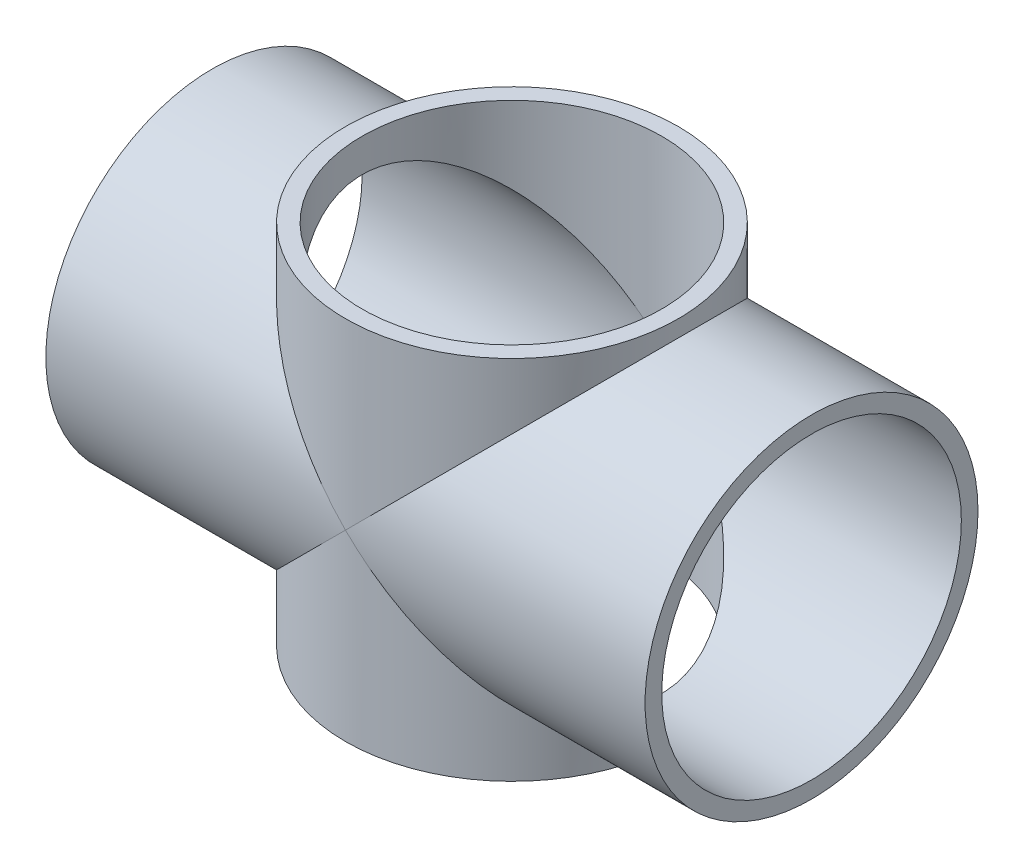
ISO-10303-21;
HEADER;
FILE_DESCRIPTION(('STEP AP214'),'2;1');
FILE_NAME('part.step','',(''),(''),'','','');
FILE_SCHEMA(('AUTOMOTIVE_DESIGN { 1 0 10303 214 1 1 1 1 }'));
ENDSEC;
DATA;
#1=APPLICATION_CONTEXT('core data for automotive mechanical design processes');
#2=APPLICATION_PROTOCOL_DEFINITION('international standard','automotive_design',2000,#1);
#3=PRODUCT_CONTEXT('',#1,'mechanical');
#4=PRODUCT('Part','Part','',(#3));
#5=PRODUCT_RELATED_PRODUCT_CATEGORY('part','',(#4));
#6=PRODUCT_DEFINITION_FORMATION('','',#4);
#7=PRODUCT_DEFINITION_CONTEXT('part definition',#1,'design');
#8=PRODUCT_DEFINITION('design','',#6,#7);
#9=PRODUCT_DEFINITION_SHAPE('','',#8);
#10=(LENGTH_UNIT() NAMED_UNIT(*) SI_UNIT(.MILLI.,.METRE.));
#11=(NAMED_UNIT(*) PLANE_ANGLE_UNIT() SI_UNIT($,.RADIAN.));
#12=(NAMED_UNIT(*) SI_UNIT($,.STERADIAN.) SOLID_ANGLE_UNIT());
#13=UNCERTAINTY_MEASURE_WITH_UNIT(LENGTH_MEASURE(1.E-05),#10,'distance_accuracy_value','');
#14=(GEOMETRIC_REPRESENTATION_CONTEXT(3) GLOBAL_UNCERTAINTY_ASSIGNED_CONTEXT((#13)) GLOBAL_UNIT_ASSIGNED_CONTEXT((#10,
#11,#12)) REPRESENTATION_CONTEXT('',''));
#15=CARTESIAN_POINT('',(0.,0.,0.));
#16=DIRECTION('',(0.,0.,1.));
#17=DIRECTION('',(1.,0.,0.));
#18=AXIS2_PLACEMENT_3D('',#15,#16,#17);
#19=CARTESIAN_POINT('',(-114.3,114.3,0.));
#20=DIRECTION('',(1.,0.,0.));
#21=DIRECTION('',(0.,0.,-1.));
#22=AXIS2_PLACEMENT_3D('',#19,#20,#21);
#23=CYLINDRICAL_SURFACE('',#22,57.15);
#24=CARTESIAN_POINT('',(114.3,114.3,0.));
#25=DIRECTION('',(1.,0.,0.));
#26=DIRECTION('',(0.,0.,-1.));
#27=AXIS2_PLACEMENT_3D('',#24,#25,#26);
#28=CIRCLE('',#27,57.15);
#29=CARTESIAN_POINT('',(114.3,114.3,-57.15));
#30=VERTEX_POINT('',#29);
#31=EDGE_CURVE('E81',#30,#30,#28,.T.);
#32=ORIENTED_EDGE('',*,*,#31,.T.);
#33=EDGE_LOOP('',(#32));
#34=FACE_BOUND('',#33,.T.);
#35=CARTESIAN_POINT('',(0.,114.3,0.));
#36=DIRECTION('',(0.707106781186547,-0.707106781186547,0.));
#37=DIRECTION('',(0.707106781186547,0.707106781186547,0.));
#38=AXIS2_PLACEMENT_3D('',#35,#36,#37);
#39=ELLIPSE('',#38,80.8223050896224,57.15);
#40=CARTESIAN_POINT('',(0.,114.3,57.15));
#41=VERTEX_POINT('',#40);
#42=CARTESIAN_POINT('',(0.,114.3,-57.15));
#43=VERTEX_POINT('',#42);
#44=EDGE_CURVE('E54',#41,#43,#39,.F.);
#45=ORIENTED_EDGE('',*,*,#44,.T.);
#46=CARTESIAN_POINT('',(0.,114.3,0.));
#47=DIRECTION('',(0.707106781186547,0.707106781186547,0.));
#48=DIRECTION('',(0.707106781186547,-0.707106781186547,0.));
#49=AXIS2_PLACEMENT_3D('',#46,#47,#48);
#50=ELLIPSE('',#49,80.8223050896224,57.15);
#51=EDGE_CURVE('E72',#43,#41,#50,.F.);
#52=ORIENTED_EDGE('',*,*,#51,.T.);
#53=EDGE_LOOP('',(#45,#52));
#54=FACE_BOUND('',#53,.T.);
#55=ADVANCED_FACE('F38',(#34,#54),#23,.F.);
#56=CARTESIAN_POINT('',(0.,228.6,0.));
#57=DIRECTION('',(0.,-1.,0.));
#58=DIRECTION('',(0.,0.,-1.));
#59=AXIS2_PLACEMENT_3D('',#56,#57,#58);
#60=CYLINDRICAL_SURFACE('',#59,63.5);
#61=CARTESIAN_POINT('',(0.,184.15,0.));
#62=DIRECTION('',(0.,-1.,0.));
#63=DIRECTION('',(0.,0.,-1.));
#64=AXIS2_PLACEMENT_3D('',#61,#62,#63);
#65=CIRCLE('',#64,63.5);
#66=CARTESIAN_POINT('',(0.,184.15,-63.5));
#67=VERTEX_POINT('',#66);
#68=EDGE_CURVE('E79',#67,#67,#65,.T.);
#69=ORIENTED_EDGE('',*,*,#68,.T.);
#70=EDGE_LOOP('',(#69));
#71=FACE_BOUND('',#70,.T.);
#72=CARTESIAN_POINT('',(0.,114.3,0.));
#73=DIRECTION('',(-0.707106781186547,-0.707106781186547,0.));
#74=DIRECTION('',(0.707106781186547,-0.707106781186547,0.));
#75=AXIS2_PLACEMENT_3D('',#72,#73,#74);
#76=ELLIPSE('',#75,89.8025612106915,63.5);
#77=CARTESIAN_POINT('',(0.,114.3,-63.5));
#78=VERTEX_POINT('',#77);
#79=CARTESIAN_POINT('',(0.,114.3,63.5));
#80=VERTEX_POINT('',#79);
#81=EDGE_CURVE('E60',#78,#80,#76,.F.);
#82=ORIENTED_EDGE('',*,*,#81,.T.);
#83=CARTESIAN_POINT('',(0.,114.3,0.));
#84=DIRECTION('',(0.707106781186547,-0.707106781186547,0.));
#85=DIRECTION('',(-0.707106781186547,-0.707106781186547,0.));
#86=AXIS2_PLACEMENT_3D('',#83,#84,#85);
#87=ELLIPSE('',#86,89.8025612106915,63.5);
#88=EDGE_CURVE('E11',#80,#78,#87,.F.);
#89=ORIENTED_EDGE('',*,*,#88,.T.);
#90=EDGE_LOOP('',(#82,#89));
#91=FACE_BOUND('',#90,.T.);
#92=ADVANCED_FACE('F117',(#71,#91),#60,.T.);
#93=CARTESIAN_POINT('',(0.,228.6,0.));
#94=DIRECTION('',(0.,-1.,0.));
#95=DIRECTION('',(0.,0.,-1.));
#96=AXIS2_PLACEMENT_3D('',#93,#94,#95);
#97=CYLINDRICAL_SURFACE('',#96,57.15);
#98=CARTESIAN_POINT('',(0.,184.15,0.));
#99=DIRECTION('',(0.,-1.,0.));
#100=DIRECTION('',(0.,0.,-1.));
#101=AXIS2_PLACEMENT_3D('',#98,#99,#100);
#102=CIRCLE('',#101,57.15);
#103=CARTESIAN_POINT('',(0.,184.15,-57.15));
#104=VERTEX_POINT('',#103);
#105=EDGE_CURVE('E42',#104,#104,#102,.T.);
#106=ORIENTED_EDGE('',*,*,#105,.F.);
#107=EDGE_LOOP('',(#106));
#108=FACE_BOUND('',#107,.T.);
#109=ORIENTED_EDGE('',*,*,#44,.F.);
#110=CARTESIAN_POINT('',(0.,114.3,0.));
#111=DIRECTION('',(0.707106781186547,0.707106781186547,0.));
#112=DIRECTION('',(0.707106781186547,-0.707106781186547,0.));
#113=AXIS2_PLACEMENT_3D('',#110,#111,#112);
#114=ELLIPSE('',#113,80.8223050896224,57.15);
#115=EDGE_CURVE('E75',#43,#41,#114,.T.);
#116=ORIENTED_EDGE('',*,*,#115,.F.);
#117=EDGE_LOOP('',(#109,#116));
#118=FACE_BOUND('',#117,.T.);
#119=ADVANCED_FACE('F78',(#108,#118),#97,.F.);
#120=CARTESIAN_POINT('',(-114.3,114.3,0.));
#121=DIRECTION('',(1.,0.,0.));
#122=DIRECTION('',(0.,0.,-1.));
#123=AXIS2_PLACEMENT_3D('',#120,#121,#122);
#124=CYLINDRICAL_SURFACE('',#123,63.5);
#125=CARTESIAN_POINT('',(114.3,114.3,0.));
#126=DIRECTION('',(1.,0.,0.));
#127=DIRECTION('',(0.,0.,-1.));
#128=AXIS2_PLACEMENT_3D('',#125,#126,#127);
#129=CIRCLE('',#128,63.5);
#130=CARTESIAN_POINT('',(114.3,114.3,-63.5));
#131=VERTEX_POINT('',#130);
#132=EDGE_CURVE('E89',#131,#131,#129,.T.);
#133=ORIENTED_EDGE('',*,*,#132,.F.);
#134=EDGE_LOOP('',(#133));
#135=FACE_BOUND('',#134,.T.);
#136=ORIENTED_EDGE('',*,*,#88,.F.);
#137=CARTESIAN_POINT('',(0.,114.3,0.));
#138=DIRECTION('',(-0.707106781186547,-0.707106781186547,0.));
#139=DIRECTION('',(0.707106781186547,-0.707106781186547,0.));
#140=AXIS2_PLACEMENT_3D('',#137,#138,#139);
#141=ELLIPSE('',#140,89.8025612106915,63.5);
#142=EDGE_CURVE('E99',#78,#80,#141,.T.);
#143=ORIENTED_EDGE('',*,*,#142,.F.);
#144=EDGE_LOOP('',(#136,#143));
#145=FACE_BOUND('',#144,.T.);
#146=ADVANCED_FACE('F147',(#135,#145),#124,.T.);
#147=CARTESIAN_POINT('',(114.3,114.3,0.));
#148=DIRECTION('',(1.,0.,0.));
#149=DIRECTION('',(0.,0.,-1.));
#150=AXIS2_PLACEMENT_3D('',#147,#148,#149);
#151=PLANE('',#150);
#152=ORIENTED_EDGE('',*,*,#132,.T.);
#153=EDGE_LOOP('',(#152));
#154=FACE_BOUND('',#153,.T.);
#155=ORIENTED_EDGE('',*,*,#31,.F.);
#156=EDGE_LOOP('',(#155));
#157=FACE_BOUND('',#156,.T.);
#158=ADVANCED_FACE('F144',(#154,#157),#151,.T.);
#159=CARTESIAN_POINT('',(-114.3,114.3,0.));
#160=DIRECTION('',(1.,0.,0.));
#161=DIRECTION('',(0.,0.,-1.));
#162=AXIS2_PLACEMENT_3D('',#159,#160,#161);
#163=CIRCLE('',#162,63.5);
#164=CARTESIAN_POINT('',(-114.3,114.3,-63.5));
#165=VERTEX_POINT('',#164);
#166=EDGE_CURVE('E95',#165,#165,#163,.T.);
#167=ORIENTED_EDGE('',*,*,#166,.T.);
#168=EDGE_LOOP('',(#167));
#169=FACE_BOUND('',#168,.T.);
#170=CARTESIAN_POINT('',(0.,114.3,0.));
#171=DIRECTION('',(0.707106781186547,-0.707106781186547,0.));
#172=DIRECTION('',(-0.707106781186547,-0.707106781186547,0.));
#173=AXIS2_PLACEMENT_3D('',#170,#171,#172);
#174=ELLIPSE('',#173,89.8025612106915,63.5);
#175=EDGE_CURVE('E47',#80,#78,#174,.T.);
#176=ORIENTED_EDGE('',*,*,#175,.F.);
#177=ORIENTED_EDGE('',*,*,#81,.F.);
#178=EDGE_LOOP('',(#176,#177));
#179=FACE_BOUND('',#178,.T.);
#180=ADVANCED_FACE('F138',(#169,#179),#124,.T.);
#181=CARTESIAN_POINT('',(0.,114.3,0.));
#182=DIRECTION('',(0.707106781186547,-0.707106781186547,0.));
#183=DIRECTION('',(0.707106781186547,0.707106781186547,0.));
#184=AXIS2_PLACEMENT_3D('',#181,#182,#183);
#185=ELLIPSE('',#184,80.8223050896224,57.15);
#186=EDGE_CURVE('E70',#41,#43,#185,.T.);
#187=ORIENTED_EDGE('',*,*,#186,.T.);
#188=ORIENTED_EDGE('',*,*,#115,.T.);
#189=EDGE_LOOP('',(#187,#188));
#190=FACE_BOUND('',#189,.T.);
#191=CARTESIAN_POINT('',(-114.3,114.3,0.));
#192=DIRECTION('',(1.,0.,0.));
#193=DIRECTION('',(0.,0.,-1.));
#194=AXIS2_PLACEMENT_3D('',#191,#192,#193);
#195=CIRCLE('',#194,57.15);
#196=CARTESIAN_POINT('',(-114.3,114.3,-57.15));
#197=VERTEX_POINT('',#196);
#198=EDGE_CURVE('E92',#197,#197,#195,.T.);
#199=ORIENTED_EDGE('',*,*,#198,.F.);
#200=EDGE_LOOP('',(#199));
#201=FACE_BOUND('',#200,.T.);
#202=ADVANCED_FACE('F83',(#190,#201),#23,.F.);
#203=CARTESIAN_POINT('',(-114.3,114.3,0.));
#204=DIRECTION('',(1.,0.,0.));
#205=DIRECTION('',(0.,0.,-1.));
#206=AXIS2_PLACEMENT_3D('',#203,#204,#205);
#207=PLANE('',#206);
#208=ORIENTED_EDGE('',*,*,#198,.T.);
#209=EDGE_LOOP('',(#208));
#210=FACE_BOUND('',#209,.T.);
#211=ORIENTED_EDGE('',*,*,#166,.F.);
#212=EDGE_LOOP('',(#211));
#213=FACE_BOUND('',#212,.T.);
#214=ADVANCED_FACE('F137',(#210,#213),#207,.F.);
#215=CARTESIAN_POINT('',(0.,44.45,0.));
#216=DIRECTION('',(0.,1.,0.));
#217=DIRECTION('',(0.,0.,1.));
#218=AXIS2_PLACEMENT_3D('',#215,#216,#217);
#219=CIRCLE('',#218,63.5);
#220=CARTESIAN_POINT('',(0.,44.45,63.5));
#221=VERTEX_POINT('',#220);
#222=EDGE_CURVE('E105',#221,#221,#219,.T.);
#223=ORIENTED_EDGE('',*,*,#222,.T.);
#224=EDGE_LOOP('',(#223));
#225=FACE_BOUND('',#224,.T.);
#226=ORIENTED_EDGE('',*,*,#142,.T.);
#227=ORIENTED_EDGE('',*,*,#175,.T.);
#228=EDGE_LOOP('',(#226,#227));
#229=FACE_BOUND('',#228,.T.);
#230=ADVANCED_FACE('F40',(#225,#229),#60,.T.);
#231=CARTESIAN_POINT('',(0.,44.45,0.));
#232=DIRECTION('',(0.,1.,0.));
#233=DIRECTION('',(0.,0.,1.));
#234=AXIS2_PLACEMENT_3D('',#231,#232,#233);
#235=CIRCLE('',#234,57.15);
#236=CARTESIAN_POINT('',(0.,44.45,57.15));
#237=VERTEX_POINT('',#236);
#238=EDGE_CURVE('E103',#237,#237,#235,.T.);
#239=ORIENTED_EDGE('',*,*,#238,.F.);
#240=EDGE_LOOP('',(#239));
#241=FACE_BOUND('',#240,.T.);
#242=ORIENTED_EDGE('',*,*,#186,.F.);
#243=ORIENTED_EDGE('',*,*,#51,.F.);
#244=EDGE_LOOP('',(#242,#243));
#245=FACE_BOUND('',#244,.T.);
#246=ADVANCED_FACE('F71',(#241,#245),#97,.F.);
#247=CARTESIAN_POINT('',(-114.3,44.45,83.8470898004));
#248=DIRECTION('',(0.,1.,0.));
#249=DIRECTION('',(0.,0.,1.));
#250=AXIS2_PLACEMENT_3D('',#247,#248,#249);
#251=PLANE('',#250);
#252=ORIENTED_EDGE('',*,*,#238,.T.);
#253=EDGE_LOOP('',(#252));
#254=FACE_BOUND('',#253,.T.);
#255=ORIENTED_EDGE('',*,*,#222,.F.);
#256=EDGE_LOOP('',(#255));
#257=FACE_BOUND('',#256,.T.);
#258=ADVANCED_FACE('F121',(#254,#257),#251,.F.);
#259=CARTESIAN_POINT('',(-114.3,184.15,83.8470898004));
#260=DIRECTION('',(0.,-1.,0.));
#261=DIRECTION('',(0.,0.,-1.));
#262=AXIS2_PLACEMENT_3D('',#259,#260,#261);
#263=PLANE('',#262);
#264=ORIENTED_EDGE('',*,*,#105,.T.);
#265=EDGE_LOOP('',(#264));
#266=FACE_BOUND('',#265,.T.);
#267=ORIENTED_EDGE('',*,*,#68,.F.);
#268=EDGE_LOOP('',(#267));
#269=FACE_BOUND('',#268,.T.);
#270=ADVANCED_FACE('F119',(#266,#269),#263,.F.);
#271=CLOSED_SHELL('',(#55,#92,#119,#146,#158,#180,#202,#214,#230,#246,#258,#270));
#272=MANIFOLD_SOLID_BREP('B2',#271);
#273=ADVANCED_BREP_SHAPE_REPRESENTATION('',(#18,#272),#14);
#274=SHAPE_DEFINITION_REPRESENTATION(#9,#273);
ENDSEC;
END-ISO-10303-21;
